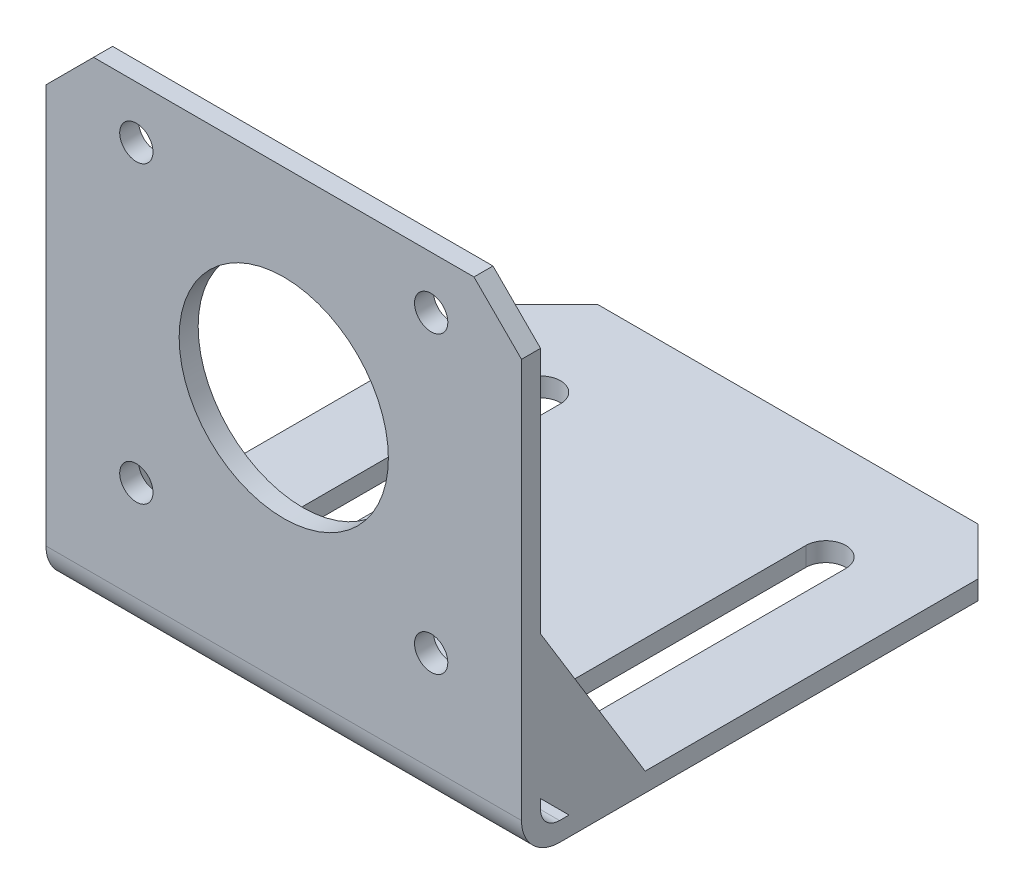
ISO-10303-21;
HEADER;
FILE_DESCRIPTION(('STEP AP214'),'2;1');
FILE_NAME('part.step','',(''),(''),'','','');
FILE_SCHEMA(('AUTOMOTIVE_DESIGN { 1 0 10303 214 1 1 1 1 }'));
ENDSEC;
DATA;
#1=APPLICATION_CONTEXT('core data for automotive mechanical design processes');
#2=APPLICATION_PROTOCOL_DEFINITION('international standard','automotive_design',2000,#1);
#3=PRODUCT_CONTEXT('',#1,'mechanical');
#4=PRODUCT('Part','Part','',(#3));
#5=PRODUCT_RELATED_PRODUCT_CATEGORY('part','',(#4));
#6=PRODUCT_DEFINITION_FORMATION('','',#4);
#7=PRODUCT_DEFINITION_CONTEXT('part definition',#1,'design');
#8=PRODUCT_DEFINITION('design','',#6,#7);
#9=PRODUCT_DEFINITION_SHAPE('','',#8);
#10=(LENGTH_UNIT() NAMED_UNIT(*) SI_UNIT(.MILLI.,.METRE.));
#11=(NAMED_UNIT(*) PLANE_ANGLE_UNIT() SI_UNIT($,.RADIAN.));
#12=(NAMED_UNIT(*) SI_UNIT($,.STERADIAN.) SOLID_ANGLE_UNIT());
#13=UNCERTAINTY_MEASURE_WITH_UNIT(LENGTH_MEASURE(1.E-05),#10,'distance_accuracy_value','');
#14=(GEOMETRIC_REPRESENTATION_CONTEXT(3) GLOBAL_UNCERTAINTY_ASSIGNED_CONTEXT((#13)) GLOBAL_UNIT_ASSIGNED_CONTEXT((#10,
#11,#12)) REPRESENTATION_CONTEXT('',''));
#15=CARTESIAN_POINT('',(0.,0.,0.));
#16=DIRECTION('',(0.,0.,1.));
#17=DIRECTION('',(1.,0.,0.));
#18=AXIS2_PLACEMENT_3D('',#15,#16,#17);
#19=CARTESIAN_POINT('',(-50.,51.,0.));
#20=DIRECTION('',(0.,1.,0.));
#21=DIRECTION('',(0.,0.,1.));
#22=AXIS2_PLACEMENT_3D('',#19,#20,#21);
#23=PLANE('',#22);
#24=DIRECTION('',(1.,0.,0.));
#25=VECTOR('',#24,1.);
#26=CARTESIAN_POINT('',(-50.,51.,0.));
#27=LINE('',#26,#25);
#28=CARTESIAN_POINT('',(-45.,51.,0.));
#29=VERTEX_POINT('',#28);
#30=CARTESIAN_POINT('',(-5.00000000000002,51.,0.));
#31=VERTEX_POINT('',#30);
#32=EDGE_CURVE('E396',#29,#31,#27,.T.);
#33=ORIENTED_EDGE('',*,*,#32,.T.);
#34=DIRECTION('',(0.,0.,-1.));
#35=VECTOR('',#34,1.);
#36=CARTESIAN_POINT('',(-5.00000000000002,51.,-2.));
#37=LINE('',#36,#35);
#38=CARTESIAN_POINT('',(-5.00000000000002,51.,-2.));
#39=VERTEX_POINT('',#38);
#40=EDGE_CURVE('E445',#31,#39,#37,.T.);
#41=ORIENTED_EDGE('',*,*,#40,.T.);
#42=DIRECTION('',(1.,0.,0.));
#43=VECTOR('',#42,1.);
#44=CARTESIAN_POINT('',(-50.,51.,-2.));
#45=LINE('',#44,#43);
#46=CARTESIAN_POINT('',(-45.,51.,-2.));
#47=VERTEX_POINT('',#46);
#48=EDGE_CURVE('E413',#47,#39,#45,.T.);
#49=ORIENTED_EDGE('',*,*,#48,.F.);
#50=DIRECTION('',(0.,0.,1.));
#51=VECTOR('',#50,1.);
#52=CARTESIAN_POINT('',(-45.,51.,0.));
#53=LINE('',#52,#51);
#54=EDGE_CURVE('E442',#47,#29,#53,.T.);
#55=ORIENTED_EDGE('',*,*,#54,.T.);
#56=EDGE_LOOP('',(#33,#41,#49,#55));
#57=FACE_BOUND('',#56,.T.);
#58=ADVANCED_FACE('F36',(#57),#23,.T.);
#59=CARTESIAN_POINT('',(-50.,51.,-2.));
#60=DIRECTION('',(0.,0.,-1.));
#61=DIRECTION('',(-1.,0.,0.));
#62=AXIS2_PLACEMENT_3D('',#59,#60,#61);
#63=PLANE('',#62);
#64=CARTESIAN_POINT('',(-9.50000000000029,14.4999999999999,-2.));
#65=DIRECTION('',(0.,0.,-1.));
#66=DIRECTION('',(-1.,0.,0.));
#67=AXIS2_PLACEMENT_3D('',#64,#65,#66);
#68=CIRCLE('',#67,1.75000000000061);
#69=CARTESIAN_POINT('',(-11.2500000000009,14.4999999999999,-2.));
#70=VERTEX_POINT('',#69);
#71=EDGE_CURVE('E319',#70,#70,#68,.T.);
#72=ORIENTED_EDGE('',*,*,#71,.F.);
#73=EDGE_LOOP('',(#72));
#74=FACE_BOUND('',#73,.T.);
#75=CARTESIAN_POINT('',(-40.5000000000003,14.4999999999981,-2.));
#76=DIRECTION('',(0.,0.,-1.));
#77=DIRECTION('',(-1.,0.,0.));
#78=AXIS2_PLACEMENT_3D('',#75,#76,#77);
#79=CIRCLE('',#78,1.75000000000109);
#80=CARTESIAN_POINT('',(-42.2500000000014,14.4999999999981,-2.));
#81=VERTEX_POINT('',#80);
#82=EDGE_CURVE('E316',#81,#81,#79,.T.);
#83=ORIENTED_EDGE('',*,*,#82,.F.);
#84=EDGE_LOOP('',(#83));
#85=FACE_BOUND('',#84,.T.);
#86=CARTESIAN_POINT('',(-40.5000000000013,45.4999999999995,-2.));
#87=DIRECTION('',(0.,0.,-1.));
#88=DIRECTION('',(-1.,0.,0.));
#89=AXIS2_PLACEMENT_3D('',#86,#87,#88);
#90=CIRCLE('',#89,1.7500000000013);
#91=CARTESIAN_POINT('',(-42.2500000000026,45.4999999999995,-2.));
#92=VERTEX_POINT('',#91);
#93=EDGE_CURVE('E313',#92,#92,#90,.T.);
#94=ORIENTED_EDGE('',*,*,#93,.F.);
#95=EDGE_LOOP('',(#94));
#96=FACE_BOUND('',#95,.T.);
#97=CARTESIAN_POINT('',(-9.50000000000192,45.4999999999996,-2.));
#98=DIRECTION('',(0.,0.,-1.));
#99=DIRECTION('',(-1.,0.,0.));
#100=AXIS2_PLACEMENT_3D('',#97,#98,#99);
#101=CIRCLE('',#100,1.75000000000195);
#102=CARTESIAN_POINT('',(-11.2500000000039,45.4999999999996,-2.));
#103=VERTEX_POINT('',#102);
#104=EDGE_CURVE('E310',#103,#103,#101,.T.);
#105=ORIENTED_EDGE('',*,*,#104,.F.);
#106=EDGE_LOOP('',(#105));
#107=FACE_BOUND('',#106,.T.);
#108=CARTESIAN_POINT('',(-25.,30.,-2.));
#109=DIRECTION('',(0.,0.,-1.));
#110=DIRECTION('',(-1.,0.,0.));
#111=AXIS2_PLACEMENT_3D('',#108,#109,#110);
#112=CIRCLE('',#111,11.);
#113=CARTESIAN_POINT('',(-36.,30.,-2.));
#114=VERTEX_POINT('',#113);
#115=EDGE_CURVE('E307',#114,#114,#112,.T.);
#116=ORIENTED_EDGE('',*,*,#115,.F.);
#117=EDGE_LOOP('',(#116));
#118=FACE_BOUND('',#117,.T.);
#119=ORIENTED_EDGE('',*,*,#48,.T.);
#120=DIRECTION('',(0.707106781186549,-0.707106781186547,0.));
#121=VECTOR('',#120,1.);
#122=CARTESIAN_POINT('',(-27.5000000000001,73.5,-2.));
#123=LINE('',#122,#121);
#124=CARTESIAN_POINT('',(0.,46.,-2.));
#125=VERTEX_POINT('',#124);
#126=EDGE_CURVE('E449',#39,#125,#123,.T.);
#127=ORIENTED_EDGE('',*,*,#126,.T.);
#128=DIRECTION('',(0.,1.,0.));
#129=VECTOR('',#128,1.);
#130=CARTESIAN_POINT('',(0.,51.,-2.));
#131=LINE('',#130,#129);
#132=CARTESIAN_POINT('',(0.,20.,-1.99999999999999));
#133=VERTEX_POINT('',#132);
#134=EDGE_CURVE('E410',#133,#125,#131,.T.);
#135=ORIENTED_EDGE('',*,*,#134,.F.);
#136=DIRECTION('',(1.,0.,0.));
#137=VECTOR('',#136,1.);
#138=CARTESIAN_POINT('',(-2.,20.,-2.));
#139=LINE('',#138,#137);
#140=CARTESIAN_POINT('',(-2.,20.,-2.));
#141=VERTEX_POINT('',#140);
#142=EDGE_CURVE('E367',#141,#133,#139,.T.);
#143=ORIENTED_EDGE('',*,*,#142,.F.);
#144=DIRECTION('',(0.,-1.,0.));
#145=VECTOR('',#144,1.);
#146=CARTESIAN_POINT('',(-2.,5.,-2.));
#147=LINE('',#146,#145);
#148=CARTESIAN_POINT('',(-2.,5.,-2.));
#149=VERTEX_POINT('',#148);
#150=EDGE_CURVE('E351',#141,#149,#147,.T.);
#151=ORIENTED_EDGE('',*,*,#150,.T.);
#152=DIRECTION('',(1.,0.,0.));
#153=VECTOR('',#152,1.);
#154=CARTESIAN_POINT('',(-2.,5.,-2.));
#155=LINE('',#154,#153);
#156=CARTESIAN_POINT('',(0.,5.,-2.));
#157=VERTEX_POINT('',#156);
#158=EDGE_CURVE('E364',#149,#157,#155,.T.);
#159=ORIENTED_EDGE('',*,*,#158,.T.);
#160=CARTESIAN_POINT('',(0.,4.,-2.));
#161=VERTEX_POINT('',#160);
#162=EDGE_CURVE('E382',#161,#157,#131,.T.);
#163=ORIENTED_EDGE('',*,*,#162,.F.);
#164=DIRECTION('',(1.,0.,0.));
#165=VECTOR('',#164,1.);
#166=CARTESIAN_POINT('',(-50.,4.,-2.));
#167=LINE('',#166,#165);
#168=CARTESIAN_POINT('',(-50.,4.,-2.));
#169=VERTEX_POINT('',#168);
#170=EDGE_CURVE('E417',#169,#161,#167,.T.);
#171=ORIENTED_EDGE('',*,*,#170,.F.);
#172=DIRECTION('',(0.,1.,0.));
#173=VECTOR('',#172,1.);
#174=CARTESIAN_POINT('',(-50.,51.,-2.));
#175=LINE('',#174,#173);
#176=CARTESIAN_POINT('',(-50.,5.00000000000001,-2.));
#177=VERTEX_POINT('',#176);
#178=EDGE_CURVE('E394',#169,#177,#175,.T.);
#179=ORIENTED_EDGE('',*,*,#178,.T.);
#180=DIRECTION('',(-1.,0.,0.));
#181=VECTOR('',#180,1.);
#182=CARTESIAN_POINT('',(-48.,5.,-2.));
#183=LINE('',#182,#181);
#184=CARTESIAN_POINT('',(-48.,5.,-2.));
#185=VERTEX_POINT('',#184);
#186=EDGE_CURVE('E339',#185,#177,#183,.T.);
#187=ORIENTED_EDGE('',*,*,#186,.F.);
#188=DIRECTION('',(0.,1.,0.));
#189=VECTOR('',#188,1.);
#190=CARTESIAN_POINT('',(-48.,5.,-2.));
#191=LINE('',#190,#189);
#192=CARTESIAN_POINT('',(-48.,20.,-2.));
#193=VERTEX_POINT('',#192);
#194=EDGE_CURVE('E323',#185,#193,#191,.T.);
#195=ORIENTED_EDGE('',*,*,#194,.T.);
#196=DIRECTION('',(-1.,0.,0.));
#197=VECTOR('',#196,1.);
#198=CARTESIAN_POINT('',(-48.,20.,-2.));
#199=LINE('',#198,#197);
#200=CARTESIAN_POINT('',(-50.,20.,-2.));
#201=VERTEX_POINT('',#200);
#202=EDGE_CURVE('E334',#193,#201,#199,.T.);
#203=ORIENTED_EDGE('',*,*,#202,.T.);
#204=CARTESIAN_POINT('',(-50.,46.,-2.));
#205=VERTEX_POINT('',#204);
#206=EDGE_CURVE('E393',#201,#205,#175,.T.);
#207=ORIENTED_EDGE('',*,*,#206,.T.);
#208=DIRECTION('',(-0.707106781186547,-0.707106781186549,0.));
#209=VECTOR('',#208,1.);
#210=CARTESIAN_POINT('',(-47.5,48.5,-2.));
#211=LINE('',#210,#209);
#212=EDGE_CURVE('E447',#205,#47,#211,.F.);
#213=ORIENTED_EDGE('',*,*,#212,.T.);
#214=EDGE_LOOP('',(#119,#127,#135,#143,#151,#159,#163,#171,#179,#187,#195,#203,#207,#213));
#215=FACE_BOUND('',#214,.T.);
#216=ADVANCED_FACE('F502',(#74,#85,#96,#107,#118,#215),#63,.T.);
#217=CARTESIAN_POINT('',(-50.,4.,-4.));
#218=DIRECTION('',(1.,0.,0.));
#219=DIRECTION('',(0.,0.,-1.));
#220=AXIS2_PLACEMENT_3D('',#217,#218,#219);
#221=CYLINDRICAL_SURFACE('',#220,2.);
#222=CARTESIAN_POINT('',(0.,4.,-4.));
#223=DIRECTION('',(-1.,0.,0.));
#224=DIRECTION('',(0.,0.,1.));
#225=AXIS2_PLACEMENT_3D('',#222,#223,#224);
#226=CIRCLE('',#225,2.);
#227=CARTESIAN_POINT('',(0.,2.,-4.00000000000001));
#228=VERTEX_POINT('',#227);
#229=EDGE_CURVE('E407',#228,#161,#226,.T.);
#230=ORIENTED_EDGE('',*,*,#229,.F.);
#231=DIRECTION('',(1.,0.,0.));
#232=VECTOR('',#231,1.);
#233=CARTESIAN_POINT('',(-50.,2.,-4.00000000000001));
#234=LINE('',#233,#232);
#235=CARTESIAN_POINT('',(-50.,2.,-4.00000000000001));
#236=VERTEX_POINT('',#235);
#237=EDGE_CURVE('E419',#236,#228,#234,.T.);
#238=ORIENTED_EDGE('',*,*,#237,.F.);
#239=CARTESIAN_POINT('',(-50.,4.,-4.));
#240=DIRECTION('',(-1.,0.,0.));
#241=DIRECTION('',(0.,0.,1.));
#242=AXIS2_PLACEMENT_3D('',#239,#240,#241);
#243=CIRCLE('',#242,2.);
#244=EDGE_CURVE('E390',#236,#169,#243,.T.);
#245=ORIENTED_EDGE('',*,*,#244,.T.);
#246=ORIENTED_EDGE('',*,*,#170,.T.);
#247=EDGE_LOOP('',(#230,#238,#245,#246));
#248=FACE_BOUND('',#247,.T.);
#249=ADVANCED_FACE('F528',(#248),#221,.F.);
#250=CARTESIAN_POINT('',(-50.,2.,-4.00000000000001));
#251=DIRECTION('',(0.,1.,0.));
#252=DIRECTION('',(0.,0.,1.));
#253=AXIS2_PLACEMENT_3D('',#250,#251,#252);
#254=PLANE('',#253);
#255=CARTESIAN_POINT('',(-10.,2.,-42.));
#256=DIRECTION('',(0.,1.,0.));
#257=DIRECTION('',(0.,0.,1.));
#258=AXIS2_PLACEMENT_3D('',#255,#256,#257);
#259=CIRCLE('',#258,2.1);
#260=CARTESIAN_POINT('',(-7.9,2.,-42.));
#261=VERTEX_POINT('',#260);
#262=CARTESIAN_POINT('',(-12.1,2.,-42.));
#263=VERTEX_POINT('',#262);
#264=EDGE_CURVE('E290',#261,#263,#259,.T.);
#265=ORIENTED_EDGE('',*,*,#264,.F.);
#266=DIRECTION('',(0.,0.,-1.));
#267=VECTOR('',#266,1.);
#268=CARTESIAN_POINT('',(-7.9,2.,-4.00000000000002));
#269=LINE('',#268,#267);
#270=CARTESIAN_POINT('',(-7.9,2.,-12.));
#271=VERTEX_POINT('',#270);
#272=EDGE_CURVE('E285',#271,#261,#269,.T.);
#273=ORIENTED_EDGE('',*,*,#272,.F.);
#274=CARTESIAN_POINT('',(-10.,2.,-12.));
#275=DIRECTION('',(0.,1.,0.));
#276=DIRECTION('',(0.,0.,1.));
#277=AXIS2_PLACEMENT_3D('',#274,#275,#276);
#278=CIRCLE('',#277,2.1);
#279=CARTESIAN_POINT('',(-12.1,2.,-12.));
#280=VERTEX_POINT('',#279);
#281=EDGE_CURVE('E229',#280,#271,#278,.T.);
#282=ORIENTED_EDGE('',*,*,#281,.F.);
#283=DIRECTION('',(0.,0.,1.));
#284=VECTOR('',#283,1.);
#285=CARTESIAN_POINT('',(-12.1,2.,-4.00000000000001));
#286=LINE('',#285,#284);
#287=EDGE_CURVE('E288',#263,#280,#286,.T.);
#288=ORIENTED_EDGE('',*,*,#287,.F.);
#289=EDGE_LOOP('',(#265,#273,#282,#288));
#290=FACE_BOUND('',#289,.T.);
#291=CARTESIAN_POINT('',(-40.,2.,-42.0000000000002));
#292=DIRECTION('',(0.,1.,0.));
#293=DIRECTION('',(0.,0.,1.));
#294=AXIS2_PLACEMENT_3D('',#291,#292,#293);
#295=CIRCLE('',#294,2.1);
#296=CARTESIAN_POINT('',(-37.9,2.,-42.0000000000002));
#297=VERTEX_POINT('',#296);
#298=CARTESIAN_POINT('',(-42.1,2.,-42.0000000000002));
#299=VERTEX_POINT('',#298);
#300=EDGE_CURVE('E283',#297,#299,#295,.T.);
#301=ORIENTED_EDGE('',*,*,#300,.F.);
#302=DIRECTION('',(0.,0.,-1.));
#303=VECTOR('',#302,1.);
#304=CARTESIAN_POINT('',(-37.9,2.,-4.00000000000001));
#305=LINE('',#304,#303);
#306=CARTESIAN_POINT('',(-37.9,2.,-12.0000000000002));
#307=VERTEX_POINT('',#306);
#308=EDGE_CURVE('E254',#307,#297,#305,.T.);
#309=ORIENTED_EDGE('',*,*,#308,.F.);
#310=CARTESIAN_POINT('',(-40.,2.,-12.0000000000002));
#311=DIRECTION('',(0.,1.,0.));
#312=DIRECTION('',(0.,0.,1.));
#313=AXIS2_PLACEMENT_3D('',#310,#311,#312);
#314=CIRCLE('',#313,2.1);
#315=CARTESIAN_POINT('',(-42.1,2.,-12.0000000000002));
#316=VERTEX_POINT('',#315);
#317=EDGE_CURVE('E278',#316,#307,#314,.T.);
#318=ORIENTED_EDGE('',*,*,#317,.F.);
#319=DIRECTION('',(0.,0.,1.));
#320=VECTOR('',#319,1.);
#321=CARTESIAN_POINT('',(-42.1,2.,-4.00000000000001));
#322=LINE('',#321,#320);
#323=EDGE_CURVE('E281',#299,#316,#322,.T.);
#324=ORIENTED_EDGE('',*,*,#323,.F.);
#325=EDGE_LOOP('',(#301,#309,#318,#324));
#326=FACE_BOUND('',#325,.T.);
#327=DIRECTION('',(0.,0.,1.));
#328=VECTOR('',#327,1.);
#329=CARTESIAN_POINT('',(0.,2.,-4.00000000000001));
#330=LINE('',#329,#328);
#331=CARTESIAN_POINT('',(0.,2.,-48.));
#332=VERTEX_POINT('',#331);
#333=CARTESIAN_POINT('',(0.,2.,-13.));
#334=VERTEX_POINT('',#333);
#335=EDGE_CURVE('E405',#332,#334,#330,.T.);
#336=ORIENTED_EDGE('',*,*,#335,.F.);
#337=DIRECTION('',(-0.707106781186549,0.,-0.707106781186547));
#338=VECTOR('',#337,1.);
#339=CARTESIAN_POINT('',(-3.00000000000007,2.,-51.0000000000001));
#340=LINE('',#339,#338);
#341=CARTESIAN_POINT('',(-5.00000000000002,2.,-53.));
#342=VERTEX_POINT('',#341);
#343=EDGE_CURVE('E457',#332,#342,#340,.T.);
#344=ORIENTED_EDGE('',*,*,#343,.T.);
#345=DIRECTION('',(1.,0.,0.));
#346=VECTOR('',#345,1.);
#347=CARTESIAN_POINT('',(-50.,2.,-53.));
#348=LINE('',#347,#346);
#349=CARTESIAN_POINT('',(-45.,2.,-53.));
#350=VERTEX_POINT('',#349);
#351=EDGE_CURVE('E422',#350,#342,#348,.T.);
#352=ORIENTED_EDGE('',*,*,#351,.F.);
#353=DIRECTION('',(0.707106781186547,0.,-0.707106781186549));
#354=VECTOR('',#353,1.);
#355=CARTESIAN_POINT('',(-72.,2.,-25.9999999999999));
#356=LINE('',#355,#354);
#357=CARTESIAN_POINT('',(-50.,2.,-48.));
#358=VERTEX_POINT('',#357);
#359=EDGE_CURVE('E455',#350,#358,#356,.F.);
#360=ORIENTED_EDGE('',*,*,#359,.T.);
#361=DIRECTION('',(0.,0.,1.));
#362=VECTOR('',#361,1.);
#363=CARTESIAN_POINT('',(-50.,2.,-4.00000000000001));
#364=LINE('',#363,#362);
#365=CARTESIAN_POINT('',(-50.,2.,-13.));
#366=VERTEX_POINT('',#365);
#367=EDGE_CURVE('E388',#358,#366,#364,.T.);
#368=ORIENTED_EDGE('',*,*,#367,.T.);
#369=DIRECTION('',(-1.,0.,0.));
#370=VECTOR('',#369,1.);
#371=CARTESIAN_POINT('',(-48.,2.,-13.));
#372=LINE('',#371,#370);
#373=CARTESIAN_POINT('',(-48.,2.,-13.));
#374=VERTEX_POINT('',#373);
#375=EDGE_CURVE('E346',#374,#366,#372,.T.);
#376=ORIENTED_EDGE('',*,*,#375,.F.);
#377=DIRECTION('',(0.,0.,1.));
#378=VECTOR('',#377,1.);
#379=CARTESIAN_POINT('',(-48.,2.,-13.));
#380=LINE('',#379,#378);
#381=CARTESIAN_POINT('',(-48.,2.,-5.));
#382=VERTEX_POINT('',#381);
#383=EDGE_CURVE('E329',#374,#382,#380,.T.);
#384=ORIENTED_EDGE('',*,*,#383,.T.);
#385=DIRECTION('',(-1.,0.,0.));
#386=VECTOR('',#385,1.);
#387=CARTESIAN_POINT('',(-48.,2.,-5.));
#388=LINE('',#387,#386);
#389=CARTESIAN_POINT('',(-50.,2.,-5.));
#390=VERTEX_POINT('',#389);
#391=EDGE_CURVE('E343',#382,#390,#388,.T.);
#392=ORIENTED_EDGE('',*,*,#391,.T.);
#393=EDGE_CURVE('E387',#390,#236,#364,.T.);
#394=ORIENTED_EDGE('',*,*,#393,.T.);
#395=ORIENTED_EDGE('',*,*,#237,.T.);
#396=CARTESIAN_POINT('',(0.,2.,-5.));
#397=VERTEX_POINT('',#396);
#398=EDGE_CURVE('E404',#397,#228,#330,.T.);
#399=ORIENTED_EDGE('',*,*,#398,.F.);
#400=DIRECTION('',(1.,0.,0.));
#401=VECTOR('',#400,1.);
#402=CARTESIAN_POINT('',(-2.,2.,-5.));
#403=LINE('',#402,#401);
#404=CARTESIAN_POINT('',(-2.,2.,-5.));
#405=VERTEX_POINT('',#404);
#406=EDGE_CURVE('E374',#405,#397,#403,.T.);
#407=ORIENTED_EDGE('',*,*,#406,.F.);
#408=DIRECTION('',(0.,0.,-1.));
#409=VECTOR('',#408,1.);
#410=CARTESIAN_POINT('',(-2.,2.,-13.));
#411=LINE('',#410,#409);
#412=CARTESIAN_POINT('',(-2.,2.,-13.));
#413=VERTEX_POINT('',#412);
#414=EDGE_CURVE('E358',#405,#413,#411,.T.);
#415=ORIENTED_EDGE('',*,*,#414,.T.);
#416=DIRECTION('',(1.,0.,0.));
#417=VECTOR('',#416,1.);
#418=CARTESIAN_POINT('',(-2.,2.,-13.));
#419=LINE('',#418,#417);
#420=EDGE_CURVE('E371',#413,#334,#419,.T.);
#421=ORIENTED_EDGE('',*,*,#420,.T.);
#422=EDGE_LOOP('',(#336,#344,#352,#360,#368,#376,#384,#392,#394,#395,#399,#407,#415,#421));
#423=FACE_BOUND('',#422,.T.);
#424=ADVANCED_FACE('F468',(#290,#326,#423),#254,.T.);
#425=CARTESIAN_POINT('',(-50.,0.,-53.));
#426=DIRECTION('',(0.,0.,-1.));
#427=DIRECTION('',(-1.,0.,0.));
#428=AXIS2_PLACEMENT_3D('',#425,#426,#427);
#429=PLANE('',#428);
#430=ORIENTED_EDGE('',*,*,#351,.T.);
#431=DIRECTION('',(0.,-1.,0.));
#432=VECTOR('',#431,1.);
#433=CARTESIAN_POINT('',(-5.00000000000002,0.,-53.));
#434=LINE('',#433,#432);
#435=CARTESIAN_POINT('',(-5.00000000000002,0.,-53.));
#436=VERTEX_POINT('',#435);
#437=EDGE_CURVE('E51',#342,#436,#434,.T.);
#438=ORIENTED_EDGE('',*,*,#437,.T.);
#439=DIRECTION('',(1.,0.,0.));
#440=VECTOR('',#439,1.);
#441=CARTESIAN_POINT('',(-50.,0.,-53.));
#442=LINE('',#441,#440);
#443=CARTESIAN_POINT('',(-45.,0.,-53.));
#444=VERTEX_POINT('',#443);
#445=EDGE_CURVE('E424',#444,#436,#442,.T.);
#446=ORIENTED_EDGE('',*,*,#445,.F.);
#447=DIRECTION('',(0.,1.,0.));
#448=VECTOR('',#447,1.);
#449=CARTESIAN_POINT('',(-45.,0.,-53.));
#450=LINE('',#449,#448);
#451=EDGE_CURVE('E459',#444,#350,#450,.T.);
#452=ORIENTED_EDGE('',*,*,#451,.T.);
#453=EDGE_LOOP('',(#430,#438,#446,#452));
#454=FACE_BOUND('',#453,.T.);
#455=ADVANCED_FACE('F464',(#454),#429,.T.);
#456=CARTESIAN_POINT('',(-50.,0.,-4.00000000000003));
#457=DIRECTION('',(0.,-1.,0.));
#458=DIRECTION('',(0.,0.,-1.));
#459=AXIS2_PLACEMENT_3D('',#456,#457,#458);
#460=PLANE('',#459);
#461=CARTESIAN_POINT('',(-10.,0.,-42.));
#462=DIRECTION('',(0.,-1.,0.));
#463=DIRECTION('',(0.,0.,-1.));
#464=AXIS2_PLACEMENT_3D('',#461,#462,#463);
#465=CIRCLE('',#464,2.1);
#466=CARTESIAN_POINT('',(-12.1,0.,-42.));
#467=VERTEX_POINT('',#466);
#468=CARTESIAN_POINT('',(-7.90000000000001,0.,-42.));
#469=VERTEX_POINT('',#468);
#470=EDGE_CURVE('E242',#467,#469,#465,.T.);
#471=ORIENTED_EDGE('',*,*,#470,.F.);
#472=DIRECTION('',(0.,0.,-1.));
#473=VECTOR('',#472,1.);
#474=CARTESIAN_POINT('',(-12.1,0.,-12.));
#475=LINE('',#474,#473);
#476=CARTESIAN_POINT('',(-12.1,0.,-12.));
#477=VERTEX_POINT('',#476);
#478=EDGE_CURVE('E247',#477,#467,#475,.T.);
#479=ORIENTED_EDGE('',*,*,#478,.F.);
#480=CARTESIAN_POINT('',(-10.,0.,-12.));
#481=DIRECTION('',(0.,-1.,0.));
#482=DIRECTION('',(0.,0.,-1.));
#483=AXIS2_PLACEMENT_3D('',#480,#481,#482);
#484=CIRCLE('',#483,2.1);
#485=CARTESIAN_POINT('',(-7.9,0.,-12.));
#486=VERTEX_POINT('',#485);
#487=EDGE_CURVE('E226',#486,#477,#484,.T.);
#488=ORIENTED_EDGE('',*,*,#487,.F.);
#489=DIRECTION('',(0.,0.,1.));
#490=VECTOR('',#489,1.);
#491=CARTESIAN_POINT('',(-7.9,0.,-42.));
#492=LINE('',#491,#490);
#493=EDGE_CURVE('E237',#469,#486,#492,.T.);
#494=ORIENTED_EDGE('',*,*,#493,.F.);
#495=EDGE_LOOP('',(#471,#479,#488,#494));
#496=FACE_BOUND('',#495,.T.);
#497=CARTESIAN_POINT('',(-40.,0.,-42.0000000000002));
#498=DIRECTION('',(0.,-1.,0.));
#499=DIRECTION('',(0.,0.,-1.));
#500=AXIS2_PLACEMENT_3D('',#497,#498,#499);
#501=CIRCLE('',#500,2.1);
#502=CARTESIAN_POINT('',(-42.1,0.,-42.0000000000002));
#503=VERTEX_POINT('',#502);
#504=CARTESIAN_POINT('',(-37.9,0.,-42.0000000000002));
#505=VERTEX_POINT('',#504);
#506=EDGE_CURVE('E257',#503,#505,#501,.T.);
#507=ORIENTED_EDGE('',*,*,#506,.F.);
#508=DIRECTION('',(0.,0.,-1.));
#509=VECTOR('',#508,1.);
#510=CARTESIAN_POINT('',(-42.1,0.,-12.0000000000002));
#511=LINE('',#510,#509);
#512=CARTESIAN_POINT('',(-42.1,0.,-12.0000000000002));
#513=VERTEX_POINT('',#512);
#514=EDGE_CURVE('E265',#513,#503,#511,.T.);
#515=ORIENTED_EDGE('',*,*,#514,.F.);
#516=CARTESIAN_POINT('',(-40.,0.,-12.0000000000002));
#517=DIRECTION('',(0.,-1.,0.));
#518=DIRECTION('',(0.,0.,-1.));
#519=AXIS2_PLACEMENT_3D('',#516,#517,#518);
#520=CIRCLE('',#519,2.1);
#521=CARTESIAN_POINT('',(-37.9,0.,-12.0000000000002));
#522=VERTEX_POINT('',#521);
#523=EDGE_CURVE('E262',#522,#513,#520,.T.);
#524=ORIENTED_EDGE('',*,*,#523,.F.);
#525=DIRECTION('',(0.,0.,1.));
#526=VECTOR('',#525,1.);
#527=CARTESIAN_POINT('',(-37.9,0.,-42.0000000000002));
#528=LINE('',#527,#526);
#529=EDGE_CURVE('E259',#505,#522,#528,.T.);
#530=ORIENTED_EDGE('',*,*,#529,.F.);
#531=EDGE_LOOP('',(#507,#515,#524,#530));
#532=FACE_BOUND('',#531,.T.);
#533=ORIENTED_EDGE('',*,*,#445,.T.);
#534=DIRECTION('',(0.707106781186549,0.,0.707106781186547));
#535=VECTOR('',#534,1.);
#536=CARTESIAN_POINT('',(-3.00000000000009,0.,-51.0000000000001));
#537=LINE('',#536,#535);
#538=CARTESIAN_POINT('',(0.,0.,-48.));
#539=VERTEX_POINT('',#538);
#540=EDGE_CURVE('E11',#436,#539,#537,.T.);
#541=ORIENTED_EDGE('',*,*,#540,.T.);
#542=DIRECTION('',(0.,0.,-1.));
#543=VECTOR('',#542,1.);
#544=CARTESIAN_POINT('',(0.,0.,-4.00000000000003));
#545=LINE('',#544,#543);
#546=CARTESIAN_POINT('',(0.,0.,-4.00000000000003));
#547=VERTEX_POINT('',#546);
#548=EDGE_CURVE('E401',#547,#539,#545,.T.);
#549=ORIENTED_EDGE('',*,*,#548,.F.);
#550=DIRECTION('',(1.,0.,0.));
#551=VECTOR('',#550,1.);
#552=CARTESIAN_POINT('',(-50.,0.,-4.00000000000003));
#553=LINE('',#552,#551);
#554=CARTESIAN_POINT('',(-50.,0.,-4.00000000000003));
#555=VERTEX_POINT('',#554);
#556=EDGE_CURVE('E426',#555,#547,#553,.T.);
#557=ORIENTED_EDGE('',*,*,#556,.F.);
#558=DIRECTION('',(0.,0.,-1.));
#559=VECTOR('',#558,1.);
#560=CARTESIAN_POINT('',(-50.,0.,-4.00000000000003));
#561=LINE('',#560,#559);
#562=CARTESIAN_POINT('',(-50.,0.,-48.));
#563=VERTEX_POINT('',#562);
#564=EDGE_CURVE('E385',#555,#563,#561,.T.);
#565=ORIENTED_EDGE('',*,*,#564,.T.);
#566=DIRECTION('',(-0.707106781186547,0.,0.707106781186549));
#567=VECTOR('',#566,1.);
#568=CARTESIAN_POINT('',(-72.,0.,-25.9999999999999));
#569=LINE('',#568,#567);
#570=EDGE_CURVE('E44',#563,#444,#569,.F.);
#571=ORIENTED_EDGE('',*,*,#570,.T.);
#572=EDGE_LOOP('',(#533,#541,#549,#557,#565,#571));
#573=FACE_BOUND('',#572,.T.);
#574=ADVANCED_FACE('F244',(#496,#532,#573),#460,.T.);
#575=CARTESIAN_POINT('',(-50.,4.,-4.));
#576=DIRECTION('',(1.,0.,0.));
#577=DIRECTION('',(0.,0.,-1.));
#578=AXIS2_PLACEMENT_3D('',#575,#576,#577);
#579=CYLINDRICAL_SURFACE('',#578,4.);
#580=CARTESIAN_POINT('',(0.,4.,-4.));
#581=DIRECTION('',(1.,0.,0.));
#582=DIRECTION('',(0.,0.,1.));
#583=AXIS2_PLACEMENT_3D('',#580,#581,#582);
#584=CIRCLE('',#583,4.);
#585=CARTESIAN_POINT('',(0.,4.00000000000003,0.));
#586=VERTEX_POINT('',#585);
#587=EDGE_CURVE('E398',#586,#547,#584,.T.);
#588=ORIENTED_EDGE('',*,*,#587,.F.);
#589=DIRECTION('',(1.,0.,0.));
#590=VECTOR('',#589,1.);
#591=CARTESIAN_POINT('',(-50.,4.00000000000003,0.));
#592=LINE('',#591,#590);
#593=CARTESIAN_POINT('',(-50.,4.00000000000003,0.));
#594=VERTEX_POINT('',#593);
#595=EDGE_CURVE('E428',#594,#586,#592,.T.);
#596=ORIENTED_EDGE('',*,*,#595,.F.);
#597=CARTESIAN_POINT('',(-50.,4.,-4.));
#598=DIRECTION('',(1.,0.,0.));
#599=DIRECTION('',(0.,0.,1.));
#600=AXIS2_PLACEMENT_3D('',#597,#598,#599);
#601=CIRCLE('',#600,4.);
#602=EDGE_CURVE('E381',#594,#555,#601,.T.);
#603=ORIENTED_EDGE('',*,*,#602,.T.);
#604=ORIENTED_EDGE('',*,*,#556,.T.);
#605=EDGE_LOOP('',(#588,#596,#603,#604));
#606=FACE_BOUND('',#605,.T.);
#607=ADVANCED_FACE('F489',(#606),#579,.T.);
#608=CARTESIAN_POINT('',(-50.,51.,0.));
#609=DIRECTION('',(0.,0.,1.));
#610=DIRECTION('',(1.,0.,0.));
#611=AXIS2_PLACEMENT_3D('',#608,#609,#610);
#612=PLANE('',#611);
#613=CARTESIAN_POINT('',(-9.50000000000029,14.4999999999999,0.));
#614=DIRECTION('',(0.,0.,1.));
#615=DIRECTION('',(1.,0.,0.));
#616=AXIS2_PLACEMENT_3D('',#613,#614,#615);
#617=CIRCLE('',#616,1.75000000000061);
#618=CARTESIAN_POINT('',(-7.74999999999968,14.4999999999999,0.));
#619=VERTEX_POINT('',#618);
#620=EDGE_CURVE('E292',#619,#619,#617,.T.);
#621=ORIENTED_EDGE('',*,*,#620,.F.);
#622=EDGE_LOOP('',(#621));
#623=FACE_BOUND('',#622,.T.);
#624=CARTESIAN_POINT('',(-40.5000000000003,14.4999999999981,0.));
#625=DIRECTION('',(0.,0.,1.));
#626=DIRECTION('',(1.,0.,0.));
#627=AXIS2_PLACEMENT_3D('',#624,#625,#626);
#628=CIRCLE('',#627,1.75000000000109);
#629=CARTESIAN_POINT('',(-38.7499999999992,14.4999999999981,0.));
#630=VERTEX_POINT('',#629);
#631=EDGE_CURVE('E300',#630,#630,#628,.T.);
#632=ORIENTED_EDGE('',*,*,#631,.F.);
#633=EDGE_LOOP('',(#632));
#634=FACE_BOUND('',#633,.T.);
#635=CARTESIAN_POINT('',(-40.5000000000013,45.4999999999995,0.));
#636=DIRECTION('',(0.,0.,1.));
#637=DIRECTION('',(1.,0.,0.));
#638=AXIS2_PLACEMENT_3D('',#635,#636,#637);
#639=CIRCLE('',#638,1.7500000000013);
#640=CARTESIAN_POINT('',(-38.75,45.4999999999995,0.));
#641=VERTEX_POINT('',#640);
#642=EDGE_CURVE('E297',#641,#641,#639,.T.);
#643=ORIENTED_EDGE('',*,*,#642,.F.);
#644=EDGE_LOOP('',(#643));
#645=FACE_BOUND('',#644,.T.);
#646=CARTESIAN_POINT('',(-9.50000000000192,45.4999999999996,0.));
#647=DIRECTION('',(0.,0.,1.));
#648=DIRECTION('',(1.,0.,0.));
#649=AXIS2_PLACEMENT_3D('',#646,#647,#648);
#650=CIRCLE('',#649,1.75000000000195);
#651=CARTESIAN_POINT('',(-7.74999999999997,45.4999999999996,0.));
#652=VERTEX_POINT('',#651);
#653=EDGE_CURVE('E293',#652,#652,#650,.T.);
#654=ORIENTED_EDGE('',*,*,#653,.F.);
#655=EDGE_LOOP('',(#654));
#656=FACE_BOUND('',#655,.T.);
#657=CARTESIAN_POINT('',(-25.,30.,0.));
#658=DIRECTION('',(0.,0.,1.));
#659=DIRECTION('',(1.,0.,0.));
#660=AXIS2_PLACEMENT_3D('',#657,#658,#659);
#661=CIRCLE('',#660,11.);
#662=CARTESIAN_POINT('',(-14.,30.,0.));
#663=VERTEX_POINT('',#662);
#664=EDGE_CURVE('E296',#663,#663,#661,.T.);
#665=ORIENTED_EDGE('',*,*,#664,.F.);
#666=EDGE_LOOP('',(#665));
#667=FACE_BOUND('',#666,.T.);
#668=DIRECTION('',(0.,-1.,0.));
#669=VECTOR('',#668,1.);
#670=CARTESIAN_POINT('',(0.,51.,0.));
#671=LINE('',#670,#669);
#672=CARTESIAN_POINT('',(0.,46.,0.));
#673=VERTEX_POINT('',#672);
#674=EDGE_CURVE('E370',#673,#586,#671,.T.);
#675=ORIENTED_EDGE('',*,*,#674,.F.);
#676=DIRECTION('',(-0.707106781186549,0.707106781186547,0.));
#677=VECTOR('',#676,1.);
#678=CARTESIAN_POINT('',(-27.5000000000001,73.5,0.));
#679=LINE('',#678,#677);
#680=EDGE_CURVE('E440',#673,#31,#679,.T.);
#681=ORIENTED_EDGE('',*,*,#680,.T.);
#682=ORIENTED_EDGE('',*,*,#32,.F.);
#683=DIRECTION('',(0.707106781186547,0.707106781186549,0.));
#684=VECTOR('',#683,1.);
#685=CARTESIAN_POINT('',(-47.5,48.5,0.));
#686=LINE('',#685,#684);
#687=CARTESIAN_POINT('',(-50.,46.,0.));
#688=VERTEX_POINT('',#687);
#689=EDGE_CURVE('E438',#29,#688,#686,.F.);
#690=ORIENTED_EDGE('',*,*,#689,.T.);
#691=DIRECTION('',(0.,-1.,0.));
#692=VECTOR('',#691,1.);
#693=CARTESIAN_POINT('',(-50.,51.,0.));
#694=LINE('',#693,#692);
#695=EDGE_CURVE('E379',#688,#594,#694,.T.);
#696=ORIENTED_EDGE('',*,*,#695,.T.);
#697=ORIENTED_EDGE('',*,*,#595,.T.);
#698=EDGE_LOOP('',(#675,#681,#682,#690,#696,#697));
#699=FACE_BOUND('',#698,.T.);
#700=ADVANCED_FACE('F492',(#623,#634,#645,#656,#667,#699),#612,.T.);
#701=CARTESIAN_POINT('',(-50.,4.,-4.));
#702=DIRECTION('',(-1.,0.,0.));
#703=DIRECTION('',(0.,0.,1.));
#704=AXIS2_PLACEMENT_3D('',#701,#702,#703);
#705=PLANE('',#704);
#706=ORIENTED_EDGE('',*,*,#695,.F.);
#707=DIRECTION('',(0.,0.,-1.));
#708=VECTOR('',#707,1.);
#709=CARTESIAN_POINT('',(-50.,46.,-4.));
#710=LINE('',#709,#708);
#711=EDGE_CURVE('E453',#688,#205,#710,.T.);
#712=ORIENTED_EDGE('',*,*,#711,.T.);
#713=ORIENTED_EDGE('',*,*,#206,.F.);
#714=DIRECTION('',(0.,-0.853281833651959,-0.521450009453975));
#715=VECTOR('',#714,1.);
#716=CARTESIAN_POINT('',(-50.,20.,-2.));
#717=LINE('',#716,#715);
#718=EDGE_CURVE('E322',#201,#366,#717,.T.);
#719=ORIENTED_EDGE('',*,*,#718,.T.);
#720=ORIENTED_EDGE('',*,*,#367,.F.);
#721=DIRECTION('',(0.,-1.,0.));
#722=VECTOR('',#721,1.);
#723=CARTESIAN_POINT('',(-50.,4.,-48.));
#724=LINE('',#723,#722);
#725=EDGE_CURVE('E451',#358,#563,#724,.T.);
#726=ORIENTED_EDGE('',*,*,#725,.T.);
#727=ORIENTED_EDGE('',*,*,#564,.F.);
#728=ORIENTED_EDGE('',*,*,#602,.F.);
#729=EDGE_LOOP('',(#706,#712,#713,#719,#720,#726,#727,#728));
#730=FACE_BOUND('',#729,.T.);
#731=DIRECTION('',(0.,0.707106781186548,0.707106781186547));
#732=VECTOR('',#731,1.);
#733=CARTESIAN_POINT('',(-50.,2.,-5.));
#734=LINE('',#733,#732);
#735=EDGE_CURVE('E326',#390,#177,#734,.T.);
#736=ORIENTED_EDGE('',*,*,#735,.T.);
#737=ORIENTED_EDGE('',*,*,#178,.F.);
#738=ORIENTED_EDGE('',*,*,#244,.F.);
#739=ORIENTED_EDGE('',*,*,#393,.F.);
#740=EDGE_LOOP('',(#736,#737,#738,#739));
#741=FACE_BOUND('',#740,.T.);
#742=ADVANCED_FACE('F485',(#730,#741),#705,.T.);
#743=CARTESIAN_POINT('',(0.,4.,-4.));
#744=DIRECTION('',(-1.,0.,0.));
#745=DIRECTION('',(0.,0.,1.));
#746=AXIS2_PLACEMENT_3D('',#743,#744,#745);
#747=PLANE('',#746);
#748=ORIENTED_EDGE('',*,*,#162,.T.);
#749=DIRECTION('',(0.,-0.707106781186548,-0.707106781186547));
#750=VECTOR('',#749,1.);
#751=CARTESIAN_POINT('',(0.,2.,-5.));
#752=LINE('',#751,#750);
#753=EDGE_CURVE('E342',#157,#397,#752,.T.);
#754=ORIENTED_EDGE('',*,*,#753,.T.);
#755=ORIENTED_EDGE('',*,*,#398,.T.);
#756=ORIENTED_EDGE('',*,*,#229,.T.);
#757=EDGE_LOOP('',(#748,#754,#755,#756));
#758=FACE_BOUND('',#757,.T.);
#759=ORIENTED_EDGE('',*,*,#134,.T.);
#760=DIRECTION('',(0.,0.,1.));
#761=VECTOR('',#760,1.);
#762=CARTESIAN_POINT('',(0.,46.,0.));
#763=LINE('',#762,#761);
#764=EDGE_CURVE('E435',#125,#673,#763,.T.);
#765=ORIENTED_EDGE('',*,*,#764,.T.);
#766=ORIENTED_EDGE('',*,*,#674,.T.);
#767=ORIENTED_EDGE('',*,*,#587,.T.);
#768=ORIENTED_EDGE('',*,*,#548,.T.);
#769=DIRECTION('',(0.,1.,0.));
#770=VECTOR('',#769,1.);
#771=CARTESIAN_POINT('',(0.,2.,-48.));
#772=LINE('',#771,#770);
#773=EDGE_CURVE('E416',#539,#332,#772,.T.);
#774=ORIENTED_EDGE('',*,*,#773,.T.);
#775=ORIENTED_EDGE('',*,*,#335,.T.);
#776=DIRECTION('',(0.,0.853281833651959,0.521450009453975));
#777=VECTOR('',#776,1.);
#778=CARTESIAN_POINT('',(0.,20.,-2.));
#779=LINE('',#778,#777);
#780=EDGE_CURVE('E355',#334,#133,#779,.T.);
#781=ORIENTED_EDGE('',*,*,#780,.T.);
#782=EDGE_LOOP('',(#759,#765,#766,#767,#768,#774,#775,#781));
#783=FACE_BOUND('',#782,.T.);
#784=ADVANCED_FACE('F476',(#758,#783),#747,.F.);
#785=CARTESIAN_POINT('',(-2.,20.,-2.));
#786=DIRECTION('',(0.,0.521450009453975,-0.853281833651959));
#787=DIRECTION('',(0.,0.853281833651959,0.521450009453975));
#788=AXIS2_PLACEMENT_3D('',#785,#786,#787);
#789=PLANE('',#788);
#790=ORIENTED_EDGE('',*,*,#780,.F.);
#791=ORIENTED_EDGE('',*,*,#420,.F.);
#792=DIRECTION('',(0.,0.853281833651959,0.521450009453975));
#793=VECTOR('',#792,1.);
#794=CARTESIAN_POINT('',(-2.,20.,-2.));
#795=LINE('',#794,#793);
#796=EDGE_CURVE('E361',#413,#141,#795,.T.);
#797=ORIENTED_EDGE('',*,*,#796,.T.);
#798=ORIENTED_EDGE('',*,*,#142,.T.);
#799=EDGE_LOOP('',(#790,#791,#797,#798));
#800=FACE_BOUND('',#799,.T.);
#801=ADVANCED_FACE('F512',(#800),#789,.T.);
#802=CARTESIAN_POINT('',(-2.,2.,-5.));
#803=DIRECTION('',(0.,-0.707106781186547,0.707106781186548));
#804=DIRECTION('',(0.,-0.707106781186548,-0.707106781186547));
#805=AXIS2_PLACEMENT_3D('',#802,#803,#804);
#806=PLANE('',#805);
#807=ORIENTED_EDGE('',*,*,#753,.F.);
#808=ORIENTED_EDGE('',*,*,#158,.F.);
#809=DIRECTION('',(0.,-0.707106781186548,-0.707106781186547));
#810=VECTOR('',#809,1.);
#811=CARTESIAN_POINT('',(-2.,2.,-5.));
#812=LINE('',#811,#810);
#813=EDGE_CURVE('E354',#149,#405,#812,.T.);
#814=ORIENTED_EDGE('',*,*,#813,.T.);
#815=ORIENTED_EDGE('',*,*,#406,.T.);
#816=EDGE_LOOP('',(#807,#808,#814,#815));
#817=FACE_BOUND('',#816,.T.);
#818=ADVANCED_FACE('F520',(#817),#806,.T.);
#819=CARTESIAN_POINT('',(-2.,0.,0.));
#820=DIRECTION('',(1.,0.,0.));
#821=DIRECTION('',(0.,0.,-1.));
#822=AXIS2_PLACEMENT_3D('',#819,#820,#821);
#823=PLANE('',#822);
#824=ORIENTED_EDGE('',*,*,#150,.F.);
#825=ORIENTED_EDGE('',*,*,#796,.F.);
#826=ORIENTED_EDGE('',*,*,#414,.F.);
#827=ORIENTED_EDGE('',*,*,#813,.F.);
#828=EDGE_LOOP('',(#824,#825,#826,#827));
#829=FACE_BOUND('',#828,.T.);
#830=ADVANCED_FACE('F517',(#829),#823,.F.);
#831=CARTESIAN_POINT('',(-48.,2.,-5.));
#832=DIRECTION('',(0.,-0.707106781186547,0.707106781186548));
#833=DIRECTION('',(0.,-0.707106781186548,-0.707106781186547));
#834=AXIS2_PLACEMENT_3D('',#831,#832,#833);
#835=PLANE('',#834);
#836=ORIENTED_EDGE('',*,*,#735,.F.);
#837=ORIENTED_EDGE('',*,*,#391,.F.);
#838=DIRECTION('',(0.,0.707106781186548,0.707106781186547));
#839=VECTOR('',#838,1.);
#840=CARTESIAN_POINT('',(-48.,2.,-5.));
#841=LINE('',#840,#839);
#842=EDGE_CURVE('E331',#382,#185,#841,.T.);
#843=ORIENTED_EDGE('',*,*,#842,.T.);
#844=ORIENTED_EDGE('',*,*,#186,.T.);
#845=EDGE_LOOP('',(#836,#837,#843,#844));
#846=FACE_BOUND('',#845,.T.);
#847=ADVANCED_FACE('F532',(#846),#835,.T.);
#848=CARTESIAN_POINT('',(-48.,20.,-2.));
#849=DIRECTION('',(0.,0.521450009453975,-0.853281833651959));
#850=DIRECTION('',(0.,0.853281833651959,0.521450009453975));
#851=AXIS2_PLACEMENT_3D('',#848,#849,#850);
#852=PLANE('',#851);
#853=ORIENTED_EDGE('',*,*,#718,.F.);
#854=ORIENTED_EDGE('',*,*,#202,.F.);
#855=DIRECTION('',(0.,-0.853281833651959,-0.521450009453975));
#856=VECTOR('',#855,1.);
#857=CARTESIAN_POINT('',(-48.,20.,-2.));
#858=LINE('',#857,#856);
#859=EDGE_CURVE('E325',#193,#374,#858,.T.);
#860=ORIENTED_EDGE('',*,*,#859,.T.);
#861=ORIENTED_EDGE('',*,*,#375,.T.);
#862=EDGE_LOOP('',(#853,#854,#860,#861));
#863=FACE_BOUND('',#862,.T.);
#864=ADVANCED_FACE('F542',(#863),#852,.T.);
#865=CARTESIAN_POINT('',(-48.,0.,0.));
#866=DIRECTION('',(1.,0.,0.));
#867=DIRECTION('',(0.,0.,-1.));
#868=AXIS2_PLACEMENT_3D('',#865,#866,#867);
#869=PLANE('',#868);
#870=ORIENTED_EDGE('',*,*,#194,.F.);
#871=ORIENTED_EDGE('',*,*,#842,.F.);
#872=ORIENTED_EDGE('',*,*,#383,.F.);
#873=ORIENTED_EDGE('',*,*,#859,.F.);
#874=EDGE_LOOP('',(#870,#871,#872,#873));
#875=FACE_BOUND('',#874,.T.);
#876=ADVANCED_FACE('F538',(#875),#869,.T.);
#877=CARTESIAN_POINT('',(-25.,30.,-5.));
#878=DIRECTION('',(0.,0.,1.));
#879=DIRECTION('',(1.,0.,0.));
#880=AXIS2_PLACEMENT_3D('',#877,#878,#879);
#881=CYLINDRICAL_SURFACE('',#880,11.);
#882=ORIENTED_EDGE('',*,*,#115,.T.);
#883=EDGE_LOOP('',(#882));
#884=FACE_BOUND('',#883,.T.);
#885=ORIENTED_EDGE('',*,*,#664,.T.);
#886=EDGE_LOOP('',(#885));
#887=FACE_BOUND('',#886,.T.);
#888=ADVANCED_FACE('F685',(#884,#887),#881,.F.);
#889=CARTESIAN_POINT('',(-9.50000000000192,45.4999999999996,-5.));
#890=DIRECTION('',(0.,0.,1.));
#891=DIRECTION('',(1.,0.,0.));
#892=AXIS2_PLACEMENT_3D('',#889,#890,#891);
#893=CYLINDRICAL_SURFACE('',#892,1.75000000000195);
#894=ORIENTED_EDGE('',*,*,#104,.T.);
#895=EDGE_LOOP('',(#894));
#896=FACE_BOUND('',#895,.T.);
#897=ORIENTED_EDGE('',*,*,#653,.T.);
#898=EDGE_LOOP('',(#897));
#899=FACE_BOUND('',#898,.T.);
#900=ADVANCED_FACE('F676',(#896,#899),#893,.F.);
#901=CARTESIAN_POINT('',(-40.5000000000013,45.4999999999995,-5.));
#902=DIRECTION('',(0.,0.,1.));
#903=DIRECTION('',(1.,0.,0.));
#904=AXIS2_PLACEMENT_3D('',#901,#902,#903);
#905=CYLINDRICAL_SURFACE('',#904,1.7500000000013);
#906=ORIENTED_EDGE('',*,*,#93,.T.);
#907=EDGE_LOOP('',(#906));
#908=FACE_BOUND('',#907,.T.);
#909=ORIENTED_EDGE('',*,*,#642,.T.);
#910=EDGE_LOOP('',(#909));
#911=FACE_BOUND('',#910,.T.);
#912=ADVANCED_FACE('F667',(#908,#911),#905,.F.);
#913=CARTESIAN_POINT('',(-40.5000000000003,14.4999999999981,-5.));
#914=DIRECTION('',(0.,0.,1.));
#915=DIRECTION('',(1.,0.,0.));
#916=AXIS2_PLACEMENT_3D('',#913,#914,#915);
#917=CYLINDRICAL_SURFACE('',#916,1.75000000000109);
#918=ORIENTED_EDGE('',*,*,#82,.T.);
#919=EDGE_LOOP('',(#918));
#920=FACE_BOUND('',#919,.T.);
#921=ORIENTED_EDGE('',*,*,#631,.T.);
#922=EDGE_LOOP('',(#921));
#923=FACE_BOUND('',#922,.T.);
#924=ADVANCED_FACE('F658',(#920,#923),#917,.F.);
#925=CARTESIAN_POINT('',(-9.50000000000029,14.4999999999999,-5.));
#926=DIRECTION('',(0.,0.,1.));
#927=DIRECTION('',(1.,0.,0.));
#928=AXIS2_PLACEMENT_3D('',#925,#926,#927);
#929=CYLINDRICAL_SURFACE('',#928,1.75000000000061);
#930=ORIENTED_EDGE('',*,*,#71,.T.);
#931=EDGE_LOOP('',(#930));
#932=FACE_BOUND('',#931,.T.);
#933=ORIENTED_EDGE('',*,*,#620,.T.);
#934=EDGE_LOOP('',(#933));
#935=FACE_BOUND('',#934,.T.);
#936=ADVANCED_FACE('F649',(#932,#935),#929,.F.);
#937=CARTESIAN_POINT('',(-40.,5.,-42.0000000000002));
#938=DIRECTION('',(0.,-1.,0.));
#939=DIRECTION('',(0.,0.,-1.));
#940=AXIS2_PLACEMENT_3D('',#937,#938,#939);
#941=CYLINDRICAL_SURFACE('',#940,2.1);
#942=ORIENTED_EDGE('',*,*,#300,.T.);
#943=DIRECTION('',(0.,-1.,0.));
#944=VECTOR('',#943,1.);
#945=CARTESIAN_POINT('',(-42.1,5.,-42.0000000000002));
#946=LINE('',#945,#944);
#947=EDGE_CURVE('E269',#299,#503,#946,.T.);
#948=ORIENTED_EDGE('',*,*,#947,.T.);
#949=ORIENTED_EDGE('',*,*,#506,.T.);
#950=DIRECTION('',(0.,-1.,0.));
#951=VECTOR('',#950,1.);
#952=CARTESIAN_POINT('',(-37.9,5.,-42.0000000000002));
#953=LINE('',#952,#951);
#954=EDGE_CURVE('E268',#297,#505,#953,.T.);
#955=ORIENTED_EDGE('',*,*,#954,.F.);
#956=EDGE_LOOP('',(#942,#948,#949,#955));
#957=FACE_BOUND('',#956,.T.);
#958=ADVANCED_FACE('F640',(#957),#941,.F.);
#959=CARTESIAN_POINT('',(-42.1,5.,-12.0000000000002));
#960=DIRECTION('',(-1.,0.,0.));
#961=DIRECTION('',(0.,0.,1.));
#962=AXIS2_PLACEMENT_3D('',#959,#960,#961);
#963=PLANE('',#962);
#964=ORIENTED_EDGE('',*,*,#323,.T.);
#965=DIRECTION('',(0.,-1.,0.));
#966=VECTOR('',#965,1.);
#967=CARTESIAN_POINT('',(-42.1,5.,-12.0000000000002));
#968=LINE('',#967,#966);
#969=EDGE_CURVE('E271',#316,#513,#968,.T.);
#970=ORIENTED_EDGE('',*,*,#969,.T.);
#971=ORIENTED_EDGE('',*,*,#514,.T.);
#972=ORIENTED_EDGE('',*,*,#947,.F.);
#973=EDGE_LOOP('',(#964,#970,#971,#972));
#974=FACE_BOUND('',#973,.T.);
#975=ADVANCED_FACE('F631',(#974),#963,.F.);
#976=CARTESIAN_POINT('',(-40.,5.,-12.0000000000002));
#977=DIRECTION('',(0.,-1.,0.));
#978=DIRECTION('',(0.,0.,-1.));
#979=AXIS2_PLACEMENT_3D('',#976,#977,#978);
#980=CYLINDRICAL_SURFACE('',#979,2.1);
#981=ORIENTED_EDGE('',*,*,#317,.T.);
#982=DIRECTION('',(0.,-1.,0.));
#983=VECTOR('',#982,1.);
#984=CARTESIAN_POINT('',(-37.9,5.,-12.0000000000002));
#985=LINE('',#984,#983);
#986=EDGE_CURVE('E273',#307,#522,#985,.T.);
#987=ORIENTED_EDGE('',*,*,#986,.T.);
#988=ORIENTED_EDGE('',*,*,#523,.T.);
#989=ORIENTED_EDGE('',*,*,#969,.F.);
#990=EDGE_LOOP('',(#981,#987,#988,#989));
#991=FACE_BOUND('',#990,.T.);
#992=ADVANCED_FACE('F622',(#991),#980,.F.);
#993=CARTESIAN_POINT('',(-37.9,5.,-42.0000000000002));
#994=DIRECTION('',(1.,0.,0.));
#995=DIRECTION('',(0.,0.,-1.));
#996=AXIS2_PLACEMENT_3D('',#993,#994,#995);
#997=PLANE('',#996);
#998=ORIENTED_EDGE('',*,*,#308,.T.);
#999=ORIENTED_EDGE('',*,*,#954,.T.);
#1000=ORIENTED_EDGE('',*,*,#529,.T.);
#1001=ORIENTED_EDGE('',*,*,#986,.F.);
#1002=EDGE_LOOP('',(#998,#999,#1000,#1001));
#1003=FACE_BOUND('',#1002,.T.);
#1004=ADVANCED_FACE('F613',(#1003),#997,.F.);
#1005=CARTESIAN_POINT('',(-10.,5.,-42.));
#1006=DIRECTION('',(0.,-1.,0.));
#1007=DIRECTION('',(0.,0.,-1.));
#1008=AXIS2_PLACEMENT_3D('',#1005,#1006,#1007);
#1009=CYLINDRICAL_SURFACE('',#1008,2.1);
#1010=ORIENTED_EDGE('',*,*,#264,.T.);
#1011=DIRECTION('',(0.,-1.,0.));
#1012=VECTOR('',#1011,1.);
#1013=CARTESIAN_POINT('',(-12.1,5.,-42.));
#1014=LINE('',#1013,#1012);
#1015=EDGE_CURVE('E252',#263,#467,#1014,.T.);
#1016=ORIENTED_EDGE('',*,*,#1015,.T.);
#1017=ORIENTED_EDGE('',*,*,#470,.T.);
#1018=DIRECTION('',(0.,-1.,0.));
#1019=VECTOR('',#1018,1.);
#1020=CARTESIAN_POINT('',(-7.9,5.,-42.));
#1021=LINE('',#1020,#1019);
#1022=EDGE_CURVE('E233',#261,#469,#1021,.T.);
#1023=ORIENTED_EDGE('',*,*,#1022,.F.);
#1024=EDGE_LOOP('',(#1010,#1016,#1017,#1023));
#1025=FACE_BOUND('',#1024,.T.);
#1026=ADVANCED_FACE('F604',(#1025),#1009,.F.);
#1027=CARTESIAN_POINT('',(-12.1,5.,-12.));
#1028=DIRECTION('',(-1.,0.,0.));
#1029=DIRECTION('',(0.,0.,1.));
#1030=AXIS2_PLACEMENT_3D('',#1027,#1028,#1029);
#1031=PLANE('',#1030);
#1032=ORIENTED_EDGE('',*,*,#287,.T.);
#1033=DIRECTION('',(0.,-1.,0.));
#1034=VECTOR('',#1033,1.);
#1035=CARTESIAN_POINT('',(-12.1,5.,-12.));
#1036=LINE('',#1035,#1034);
#1037=EDGE_CURVE('E232',#280,#477,#1036,.T.);
#1038=ORIENTED_EDGE('',*,*,#1037,.T.);
#1039=ORIENTED_EDGE('',*,*,#478,.T.);
#1040=ORIENTED_EDGE('',*,*,#1015,.F.);
#1041=EDGE_LOOP('',(#1032,#1038,#1039,#1040));
#1042=FACE_BOUND('',#1041,.T.);
#1043=ADVANCED_FACE('F596',(#1042),#1031,.F.);
#1044=CARTESIAN_POINT('',(-10.,5.,-12.));
#1045=DIRECTION('',(0.,-1.,0.));
#1046=DIRECTION('',(0.,0.,-1.));
#1047=AXIS2_PLACEMENT_3D('',#1044,#1045,#1046);
#1048=CYLINDRICAL_SURFACE('',#1047,2.1);
#1049=ORIENTED_EDGE('',*,*,#281,.T.);
#1050=DIRECTION('',(0.,-1.,0.));
#1051=VECTOR('',#1050,1.);
#1052=CARTESIAN_POINT('',(-7.9,5.,-12.));
#1053=LINE('',#1052,#1051);
#1054=EDGE_CURVE('E221',#271,#486,#1053,.T.);
#1055=ORIENTED_EDGE('',*,*,#1054,.T.);
#1056=ORIENTED_EDGE('',*,*,#487,.T.);
#1057=ORIENTED_EDGE('',*,*,#1037,.F.);
#1058=EDGE_LOOP('',(#1049,#1055,#1056,#1057));
#1059=FACE_BOUND('',#1058,.T.);
#1060=ADVANCED_FACE('F223',(#1059),#1048,.F.);
#1061=CARTESIAN_POINT('',(-7.9,5.,-42.));
#1062=DIRECTION('',(1.,0.,0.));
#1063=DIRECTION('',(0.,0.,-1.));
#1064=AXIS2_PLACEMENT_3D('',#1061,#1062,#1063);
#1065=PLANE('',#1064);
#1066=ORIENTED_EDGE('',*,*,#272,.T.);
#1067=ORIENTED_EDGE('',*,*,#1022,.T.);
#1068=ORIENTED_EDGE('',*,*,#493,.T.);
#1069=ORIENTED_EDGE('',*,*,#1054,.F.);
#1070=EDGE_LOOP('',(#1066,#1067,#1068,#1069));
#1071=FACE_BOUND('',#1070,.T.);
#1072=ADVANCED_FACE('F238',(#1071),#1065,.F.);
#1073=CARTESIAN_POINT('',(0.,46.,-4.));
#1074=DIRECTION('',(0.707106781186547,0.707106781186549,0.));
#1075=DIRECTION('',(0.,0.,-1.));
#1076=AXIS2_PLACEMENT_3D('',#1073,#1074,#1075);
#1077=PLANE('',#1076);
#1078=ORIENTED_EDGE('',*,*,#126,.F.);
#1079=ORIENTED_EDGE('',*,*,#40,.F.);
#1080=ORIENTED_EDGE('',*,*,#680,.F.);
#1081=ORIENTED_EDGE('',*,*,#764,.F.);
#1082=EDGE_LOOP('',(#1078,#1079,#1080,#1081));
#1083=FACE_BOUND('',#1082,.T.);
#1084=ADVANCED_FACE('F507',(#1083),#1077,.T.);
#1085=CARTESIAN_POINT('',(-45.,51.,0.));
#1086=DIRECTION('',(0.707106781186548,-0.707106781186546,0.));
#1087=DIRECTION('',(0.,0.,1.));
#1088=AXIS2_PLACEMENT_3D('',#1085,#1086,#1087);
#1089=PLANE('',#1088);
#1090=ORIENTED_EDGE('',*,*,#212,.F.);
#1091=ORIENTED_EDGE('',*,*,#711,.F.);
#1092=ORIENTED_EDGE('',*,*,#689,.F.);
#1093=ORIENTED_EDGE('',*,*,#54,.F.);
#1094=EDGE_LOOP('',(#1090,#1091,#1092,#1093));
#1095=FACE_BOUND('',#1094,.T.);
#1096=ADVANCED_FACE('F498',(#1095),#1089,.F.);
#1097=CARTESIAN_POINT('',(0.,4.,-48.));
#1098=DIRECTION('',(0.707106781186547,0.,-0.707106781186549));
#1099=DIRECTION('',(0.,-1.,0.));
#1100=AXIS2_PLACEMENT_3D('',#1097,#1098,#1099);
#1101=PLANE('',#1100);
#1102=ORIENTED_EDGE('',*,*,#540,.F.);
#1103=ORIENTED_EDGE('',*,*,#437,.F.);
#1104=ORIENTED_EDGE('',*,*,#343,.F.);
#1105=ORIENTED_EDGE('',*,*,#773,.F.);
#1106=EDGE_LOOP('',(#1102,#1103,#1104,#1105));
#1107=FACE_BOUND('',#1106,.T.);
#1108=ADVANCED_FACE('F473',(#1107),#1101,.T.);
#1109=CARTESIAN_POINT('',(-45.,0.,-53.));
#1110=DIRECTION('',(0.707106781186548,0.,0.707106781186546));
#1111=DIRECTION('',(0.,1.,0.));
#1112=AXIS2_PLACEMENT_3D('',#1109,#1110,#1111);
#1113=PLANE('',#1112);
#1114=ORIENTED_EDGE('',*,*,#570,.F.);
#1115=ORIENTED_EDGE('',*,*,#725,.F.);
#1116=ORIENTED_EDGE('',*,*,#359,.F.);
#1117=ORIENTED_EDGE('',*,*,#451,.F.);
#1118=EDGE_LOOP('',(#1114,#1115,#1116,#1117));
#1119=FACE_BOUND('',#1118,.T.);
#1120=ADVANCED_FACE('F38',(#1119),#1113,.F.);
#1121=CLOSED_SHELL('',(#58,#216,#249,#424,#455,#574,#607,#700,#742,#784,#801,#818,#830,#847,
#864,#876,#888,#900,#912,#924,#936,#958,#975,#992,#1004,#1026,#1043,#1060,#1072,#1084,#1096,
#1108,#1120));
#1122=MANIFOLD_SOLID_BREP('B2',#1121);
#1123=ADVANCED_BREP_SHAPE_REPRESENTATION('',(#18,#1122),#14);
#1124=SHAPE_DEFINITION_REPRESENTATION(#9,#1123);
ENDSEC;
END-ISO-10303-21;
